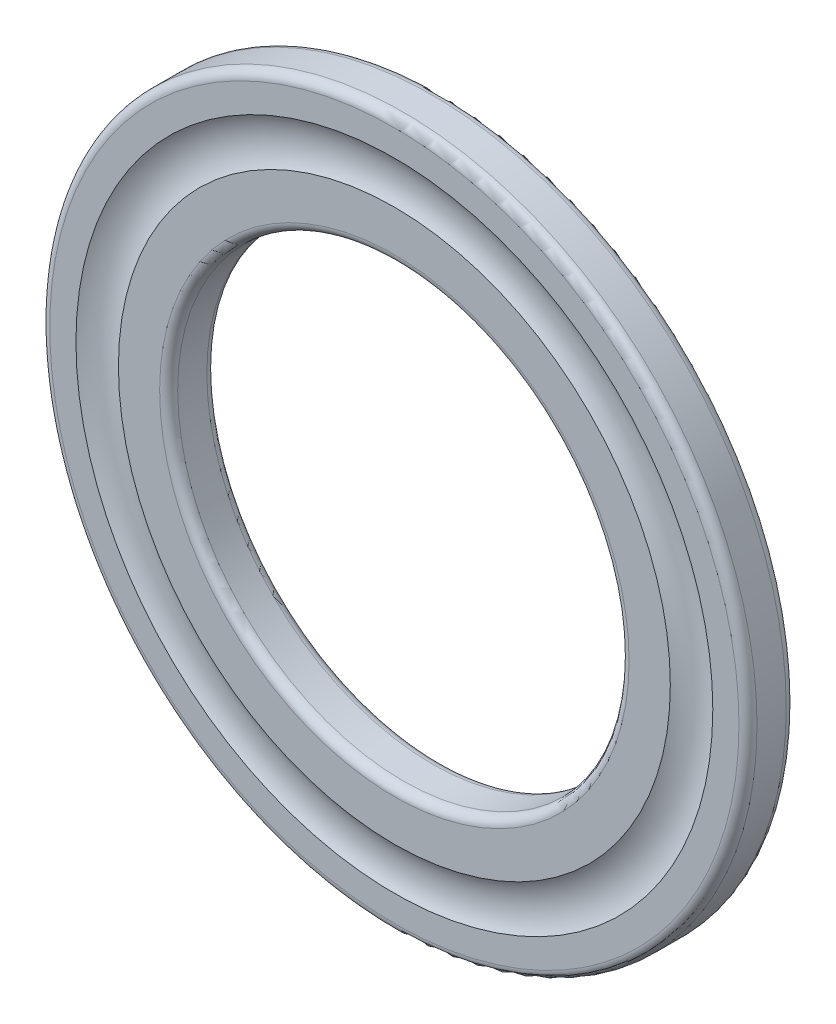
ISO-10303-21;
HEADER;
FILE_DESCRIPTION(('STEP AP214'),'2;1');
FILE_NAME('part.step','',(''),(''),'','','');
FILE_SCHEMA(('AUTOMOTIVE_DESIGN { 1 0 10303 214 1 1 1 1 }'));
ENDSEC;
DATA;
#1=APPLICATION_CONTEXT('core data for automotive mechanical design processes');
#2=APPLICATION_PROTOCOL_DEFINITION('international standard','automotive_design',2000,#1);
#3=PRODUCT_CONTEXT('',#1,'mechanical');
#4=PRODUCT('Part','Part','',(#3));
#5=PRODUCT_RELATED_PRODUCT_CATEGORY('part','',(#4));
#6=PRODUCT_DEFINITION_FORMATION('','',#4);
#7=PRODUCT_DEFINITION_CONTEXT('part definition',#1,'design');
#8=PRODUCT_DEFINITION('design','',#6,#7);
#9=PRODUCT_DEFINITION_SHAPE('','',#8);
#10=(LENGTH_UNIT() NAMED_UNIT(*) SI_UNIT(.MILLI.,.METRE.));
#11=(NAMED_UNIT(*) PLANE_ANGLE_UNIT() SI_UNIT($,.RADIAN.));
#12=(NAMED_UNIT(*) SI_UNIT($,.STERADIAN.) SOLID_ANGLE_UNIT());
#13=UNCERTAINTY_MEASURE_WITH_UNIT(LENGTH_MEASURE(1.E-05),#10,'distance_accuracy_value','');
#14=(GEOMETRIC_REPRESENTATION_CONTEXT(3) GLOBAL_UNCERTAINTY_ASSIGNED_CONTEXT((#13)) GLOBAL_UNIT_ASSIGNED_CONTEXT((#10,
#11,#12)) REPRESENTATION_CONTEXT('',''));
#15=CARTESIAN_POINT('',(0.,0.,0.));
#16=DIRECTION('',(0.,0.,1.));
#17=DIRECTION('',(1.,0.,0.));
#18=AXIS2_PLACEMENT_3D('',#15,#16,#17);
#19=CARTESIAN_POINT('',(0.,0.,3.14));
#20=DIRECTION('',(0.,0.,1.));
#21=DIRECTION('',(1.,0.,0.));
#22=AXIS2_PLACEMENT_3D('',#19,#20,#21);
#23=PLANE('',#22);
#24=CARTESIAN_POINT('',(0.,0.,3.14));
#25=DIRECTION('',(0.,0.,1.));
#26=DIRECTION('',(1.,0.,0.));
#27=AXIS2_PLACEMENT_3D('',#24,#25,#26);
#28=CIRCLE('',#27,22.9);
#29=CARTESIAN_POINT('',(22.9,0.,3.14));
#30=VERTEX_POINT('',#29);
#31=EDGE_CURVE('E10',#30,#30,#28,.T.);
#32=ORIENTED_EDGE('',*,*,#31,.T.);
#33=EDGE_LOOP('',(#32));
#34=FACE_BOUND('',#33,.T.);
#35=CARTESIAN_POINT('',(0.,0.,3.14));
#36=DIRECTION('',(0.,0.,1.));
#37=DIRECTION('',(1.,0.,0.));
#38=AXIS2_PLACEMENT_3D('',#35,#36,#37);
#39=CIRCLE('',#38,21.1617011015084);
#40=CARTESIAN_POINT('',(21.1617011015084,0.,3.14));
#41=VERTEX_POINT('',#40);
#42=EDGE_CURVE('E69',#41,#41,#39,.F.);
#43=ORIENTED_EDGE('',*,*,#42,.T.);
#44=EDGE_LOOP('',(#43));
#45=FACE_BOUND('',#44,.T.);
#46=ADVANCED_FACE('F37',(#34,#45),#23,.T.);
#47=CARTESIAN_POINT('',(0.,0.,3.14));
#48=DIRECTION('',(0.,0.,1.));
#49=DIRECTION('',(1.,0.,0.));
#50=AXIS2_PLACEMENT_3D('',#47,#48,#49);
#51=CIRCLE('',#50,15.6);
#52=CARTESIAN_POINT('',(15.6,0.,3.14));
#53=VERTEX_POINT('',#52);
#54=EDGE_CURVE('E52',#53,#53,#51,.F.);
#55=ORIENTED_EDGE('',*,*,#54,.T.);
#56=EDGE_LOOP('',(#55));
#57=FACE_BOUND('',#56,.T.);
#58=CARTESIAN_POINT('',(0.,0.,3.14));
#59=DIRECTION('',(0.,0.,-1.));
#60=DIRECTION('',(-1.,0.,0.));
#61=AXIS2_PLACEMENT_3D('',#58,#59,#60);
#62=CIRCLE('',#61,18.3382988984916);
#63=CARTESIAN_POINT('',(-18.3382988984916,0.,3.14));
#64=VERTEX_POINT('',#63);
#65=EDGE_CURVE('E72',#64,#64,#62,.F.);
#66=ORIENTED_EDGE('',*,*,#65,.T.);
#67=EDGE_LOOP('',(#66));
#68=FACE_BOUND('',#67,.T.);
#69=ADVANCED_FACE('F76',(#57,#68),#23,.T.);
#70=CARTESIAN_POINT('',(0.,0.,0.));
#71=DIRECTION('',(0.,0.,1.));
#72=DIRECTION('',(1.,0.,0.));
#73=AXIS2_PLACEMENT_3D('',#70,#71,#72);
#74=PLANE('',#73);
#75=CARTESIAN_POINT('',(0.,0.,0.));
#76=DIRECTION('',(0.,0.,1.));
#77=DIRECTION('',(1.,0.,0.));
#78=AXIS2_PLACEMENT_3D('',#75,#76,#77);
#79=CIRCLE('',#78,15.6);
#80=CARTESIAN_POINT('',(15.6,0.,0.));
#81=VERTEX_POINT('',#80);
#82=EDGE_CURVE('E63',#81,#81,#79,.T.);
#83=ORIENTED_EDGE('',*,*,#82,.T.);
#84=EDGE_LOOP('',(#83));
#85=FACE_BOUND('',#84,.T.);
#86=CARTESIAN_POINT('',(0.,0.,0.));
#87=DIRECTION('',(0.,0.,1.));
#88=DIRECTION('',(1.,0.,0.));
#89=AXIS2_PLACEMENT_3D('',#86,#87,#88);
#90=CIRCLE('',#89,22.9);
#91=CARTESIAN_POINT('',(22.9,0.,0.));
#92=VERTEX_POINT('',#91);
#93=EDGE_CURVE('E66',#92,#92,#90,.F.);
#94=ORIENTED_EDGE('',*,*,#93,.T.);
#95=EDGE_LOOP('',(#94));
#96=FACE_BOUND('',#95,.T.);
#97=ADVANCED_FACE('F100',(#85,#96),#74,.F.);
#98=CARTESIAN_POINT('',(0.,0.,3.14));
#99=DIRECTION('',(0.,0.,-1.));
#100=DIRECTION('',(-1.,0.,0.));
#101=AXIS2_PLACEMENT_3D('',#98,#99,#100);
#102=CYLINDRICAL_SURFACE('',#101,23.5);
#103=CARTESIAN_POINT('',(0.,0.,0.6));
#104=DIRECTION('',(0.,0.,1.));
#105=DIRECTION('',(1.,0.,0.));
#106=AXIS2_PLACEMENT_3D('',#103,#104,#105);
#107=CIRCLE('',#106,23.5);
#108=CARTESIAN_POINT('',(23.5,0.,0.6));
#109=VERTEX_POINT('',#108);
#110=EDGE_CURVE('E44',#109,#109,#107,.T.);
#111=ORIENTED_EDGE('',*,*,#110,.T.);
#112=EDGE_LOOP('',(#111));
#113=FACE_BOUND('',#112,.T.);
#114=CARTESIAN_POINT('',(0.,0.,2.54));
#115=DIRECTION('',(0.,0.,1.));
#116=DIRECTION('',(1.,0.,0.));
#117=AXIS2_PLACEMENT_3D('',#114,#115,#116);
#118=CIRCLE('',#117,23.5);
#119=CARTESIAN_POINT('',(23.5,0.,2.54));
#120=VERTEX_POINT('',#119);
#121=EDGE_CURVE('E48',#120,#120,#118,.F.);
#122=ORIENTED_EDGE('',*,*,#121,.T.);
#123=EDGE_LOOP('',(#122));
#124=FACE_BOUND('',#123,.T.);
#125=ADVANCED_FACE('F92',(#113,#124),#102,.T.);
#126=CARTESIAN_POINT('',(0.,0.,3.14));
#127=DIRECTION('',(0.,0.,-1.));
#128=DIRECTION('',(-1.,0.,0.));
#129=AXIS2_PLACEMENT_3D('',#126,#127,#128);
#130=CYLINDRICAL_SURFACE('',#129,15.);
#131=CARTESIAN_POINT('',(0.,0.,0.6));
#132=DIRECTION('',(0.,0.,1.));
#133=DIRECTION('',(1.,0.,0.));
#134=AXIS2_PLACEMENT_3D('',#131,#132,#133);
#135=CIRCLE('',#134,15.);
#136=CARTESIAN_POINT('',(15.,0.,0.6));
#137=VERTEX_POINT('',#136);
#138=EDGE_CURVE('E57',#137,#137,#135,.F.);
#139=ORIENTED_EDGE('',*,*,#138,.T.);
#140=EDGE_LOOP('',(#139));
#141=FACE_BOUND('',#140,.T.);
#142=CARTESIAN_POINT('',(0.,0.,2.54));
#143=DIRECTION('',(0.,0.,1.));
#144=DIRECTION('',(1.,0.,0.));
#145=AXIS2_PLACEMENT_3D('',#142,#143,#144);
#146=CIRCLE('',#145,15.);
#147=CARTESIAN_POINT('',(15.,0.,2.54));
#148=VERTEX_POINT('',#147);
#149=EDGE_CURVE('E60',#148,#148,#146,.T.);
#150=ORIENTED_EDGE('',*,*,#149,.T.);
#151=EDGE_LOOP('',(#150));
#152=FACE_BOUND('',#151,.T.);
#153=ADVANCED_FACE('F81',(#141,#152),#130,.F.);
#154=CARTESIAN_POINT('',(0.,0.,5.50000000000001));
#155=DIRECTION('',(0.,0.,-1.));
#156=DIRECTION('',(-1.,0.,0.));
#157=AXIS2_PLACEMENT_3D('',#154,#155,#156);
#158=TOROIDAL_SURFACE('',#157,19.75,2.75);
#159=ORIENTED_EDGE('',*,*,#42,.F.);
#160=EDGE_LOOP('',(#159));
#161=FACE_BOUND('',#160,.T.);
#162=ORIENTED_EDGE('',*,*,#65,.F.);
#163=EDGE_LOOP('',(#162));
#164=FACE_BOUND('',#163,.T.);
#165=ADVANCED_FACE('F78',(#161,#164),#158,.F.);
#166=CARTESIAN_POINT('',(0.,0.,0.6));
#167=DIRECTION('',(0.,0.,1.));
#168=DIRECTION('',(1.,0.,0.));
#169=AXIS2_PLACEMENT_3D('',#166,#167,#168);
#170=TOROIDAL_SURFACE('',#169,15.6,0.6);
#171=ORIENTED_EDGE('',*,*,#138,.F.);
#172=EDGE_LOOP('',(#171));
#173=FACE_BOUND('',#172,.T.);
#174=ORIENTED_EDGE('',*,*,#82,.F.);
#175=EDGE_LOOP('',(#174));
#176=FACE_BOUND('',#175,.T.);
#177=ADVANCED_FACE('F80',(#173,#176),#170,.T.);
#178=CARTESIAN_POINT('',(0.,0.,2.54));
#179=DIRECTION('',(0.,0.,1.));
#180=DIRECTION('',(1.,0.,0.));
#181=AXIS2_PLACEMENT_3D('',#178,#179,#180);
#182=TOROIDAL_SURFACE('',#181,15.6,0.6);
#183=ORIENTED_EDGE('',*,*,#54,.F.);
#184=EDGE_LOOP('',(#183));
#185=FACE_BOUND('',#184,.T.);
#186=ORIENTED_EDGE('',*,*,#149,.F.);
#187=EDGE_LOOP('',(#186));
#188=FACE_BOUND('',#187,.T.);
#189=ADVANCED_FACE('F88',(#185,#188),#182,.T.);
#190=CARTESIAN_POINT('',(0.,0.,0.6));
#191=DIRECTION('',(0.,0.,1.));
#192=DIRECTION('',(1.,0.,0.));
#193=AXIS2_PLACEMENT_3D('',#190,#191,#192);
#194=TOROIDAL_SURFACE('',#193,22.9,0.6);
#195=ORIENTED_EDGE('',*,*,#93,.F.);
#196=EDGE_LOOP('',(#195));
#197=FACE_BOUND('',#196,.T.);
#198=ORIENTED_EDGE('',*,*,#110,.F.);
#199=EDGE_LOOP('',(#198));
#200=FACE_BOUND('',#199,.T.);
#201=ADVANCED_FACE('F110',(#197,#200),#194,.T.);
#202=CARTESIAN_POINT('',(0.,0.,2.54));
#203=DIRECTION('',(0.,0.,1.));
#204=DIRECTION('',(1.,0.,0.));
#205=AXIS2_PLACEMENT_3D('',#202,#203,#204);
#206=TOROIDAL_SURFACE('',#205,22.9,0.6);
#207=ORIENTED_EDGE('',*,*,#121,.F.);
#208=EDGE_LOOP('',(#207));
#209=FACE_BOUND('',#208,.T.);
#210=ORIENTED_EDGE('',*,*,#31,.F.);
#211=EDGE_LOOP('',(#210));
#212=FACE_BOUND('',#211,.T.);
#213=ADVANCED_FACE('F39',(#209,#212),#206,.T.);
#214=CLOSED_SHELL('',(#46,#69,#97,#125,#153,#165,#177,#189,#201,#213));
#215=MANIFOLD_SOLID_BREP('B2',#214);
#216=ADVANCED_BREP_SHAPE_REPRESENTATION('',(#18,#215),#14);
#217=SHAPE_DEFINITION_REPRESENTATION(#9,#216);
ENDSEC;
END-ISO-10303-21;
